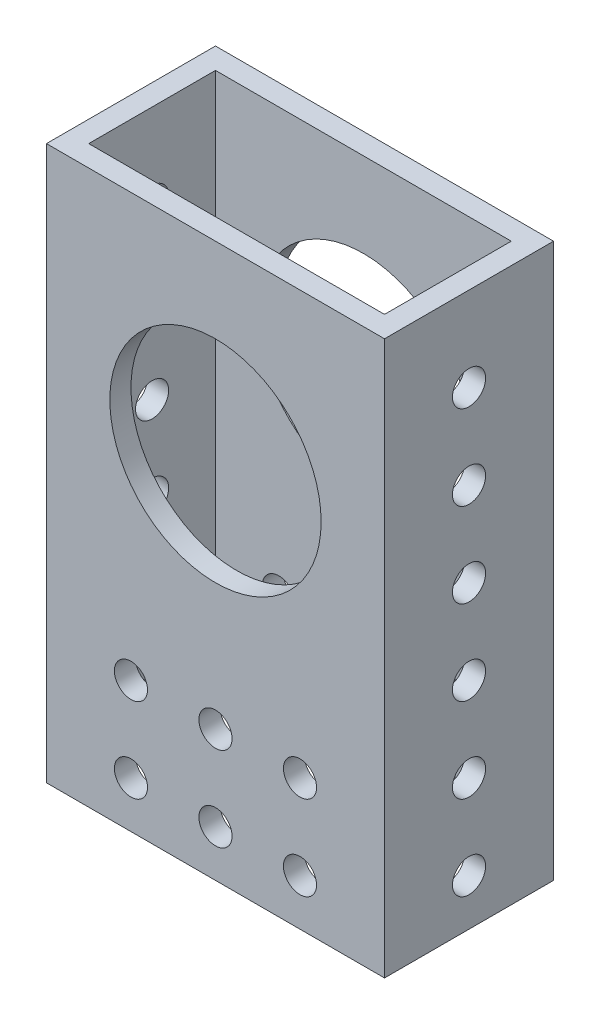
ISO-10303-21;
HEADER;
FILE_DESCRIPTION(('STEP AP214'),'2;1');
FILE_NAME('part.step','',(''),(''),'','','');
FILE_SCHEMA(('AUTOMOTIVE_DESIGN { 1 0 10303 214 1 1 1 1 }'));
ENDSEC;
DATA;
#1=APPLICATION_CONTEXT('core data for automotive mechanical design processes');
#2=APPLICATION_PROTOCOL_DEFINITION('international standard','automotive_design',2000,#1);
#3=PRODUCT_CONTEXT('',#1,'mechanical');
#4=PRODUCT('Part','Part','',(#3));
#5=PRODUCT_RELATED_PRODUCT_CATEGORY('part','',(#4));
#6=PRODUCT_DEFINITION_FORMATION('','',#4);
#7=PRODUCT_DEFINITION_CONTEXT('part definition',#1,'design');
#8=PRODUCT_DEFINITION('design','',#6,#7);
#9=PRODUCT_DEFINITION_SHAPE('','',#8);
#10=(LENGTH_UNIT() NAMED_UNIT(*) SI_UNIT(.MILLI.,.METRE.));
#11=(NAMED_UNIT(*) PLANE_ANGLE_UNIT() SI_UNIT($,.RADIAN.));
#12=(NAMED_UNIT(*) SI_UNIT($,.STERADIAN.) SOLID_ANGLE_UNIT());
#13=UNCERTAINTY_MEASURE_WITH_UNIT(LENGTH_MEASURE(1.E-05),#10,'distance_accuracy_value','');
#14=(GEOMETRIC_REPRESENTATION_CONTEXT(3) GLOBAL_UNCERTAINTY_ASSIGNED_CONTEXT((#13)) GLOBAL_UNIT_ASSIGNED_CONTEXT((#10,
#11,#12)) REPRESENTATION_CONTEXT('',''));
#15=CARTESIAN_POINT('',(0.,0.,0.));
#16=DIRECTION('',(0.,0.,1.));
#17=DIRECTION('',(1.,0.,0.));
#18=AXIS2_PLACEMENT_3D('',#15,#16,#17);
#19=CARTESIAN_POINT('',(25.4,196.85,25.4));
#20=DIRECTION('',(0.,0.,-1.));
#21=DIRECTION('',(-1.,0.,0.));
#22=AXIS2_PLACEMENT_3D('',#19,#20,#21);
#23=CYLINDRICAL_SURFACE('',#22,15.875);
#24=CARTESIAN_POINT('',(25.4,196.85,22.225));
#25=DIRECTION('',(0.,0.,1.));
#26=DIRECTION('',(1.,0.,0.));
#27=AXIS2_PLACEMENT_3D('',#24,#25,#26);
#28=CIRCLE('',#27,15.875);
#29=CARTESIAN_POINT('',(41.275,196.85,22.225));
#30=VERTEX_POINT('',#29);
#31=EDGE_CURVE('E140',#30,#30,#28,.T.);
#32=ORIENTED_EDGE('',*,*,#31,.F.);
#33=EDGE_LOOP('',(#32));
#34=FACE_BOUND('',#33,.T.);
#35=CARTESIAN_POINT('',(25.4,196.85,25.4));
#36=DIRECTION('',(0.,0.,1.));
#37=DIRECTION('',(1.,0.,0.));
#38=AXIS2_PLACEMENT_3D('',#35,#36,#37);
#39=CIRCLE('',#38,15.875);
#40=CARTESIAN_POINT('',(41.275,196.85,25.4));
#41=VERTEX_POINT('',#40);
#42=EDGE_CURVE('E120',#41,#41,#39,.T.);
#43=ORIENTED_EDGE('',*,*,#42,.T.);
#44=EDGE_LOOP('',(#43));
#45=FACE_BOUND('',#44,.T.);
#46=ADVANCED_FACE('F35',(#34,#45),#23,.F.);
#47=CARTESIAN_POINT('',(0.,212.725,12.7000000000007));
#48=DIRECTION('',(1.,0.,0.));
#49=DIRECTION('',(0.,0.,-1.));
#50=AXIS2_PLACEMENT_3D('',#47,#48,#49);
#51=CYLINDRICAL_SURFACE('',#50,2.48920000000001);
#52=CARTESIAN_POINT('',(47.625,212.725,12.7000000000007));
#53=DIRECTION('',(1.,0.,0.));
#54=DIRECTION('',(0.,1.,0.));
#55=AXIS2_PLACEMENT_3D('',#52,#53,#54);
#56=CIRCLE('',#55,2.48920000000001);
#57=CARTESIAN_POINT('',(47.625,215.2142,12.7000000000007));
#58=VERTEX_POINT('',#57);
#59=EDGE_CURVE('E314',#58,#58,#56,.F.);
#60=ORIENTED_EDGE('',*,*,#59,.T.);
#61=EDGE_LOOP('',(#60));
#62=FACE_BOUND('',#61,.T.);
#63=CARTESIAN_POINT('',(50.8,212.725,12.7000000000007));
#64=DIRECTION('',(1.,0.,0.));
#65=DIRECTION('',(0.,0.,-1.));
#66=AXIS2_PLACEMENT_3D('',#63,#64,#65);
#67=CIRCLE('',#66,2.48920000000001);
#68=CARTESIAN_POINT('',(50.8,212.725,10.2108000000007));
#69=VERTEX_POINT('',#68);
#70=EDGE_CURVE('E173',#69,#69,#67,.T.);
#71=ORIENTED_EDGE('',*,*,#70,.T.);
#72=EDGE_LOOP('',(#71));
#73=FACE_BOUND('',#72,.T.);
#74=ADVANCED_FACE('F374',(#62,#73),#51,.F.);
#75=CARTESIAN_POINT('',(0.,174.625,12.7000000000006));
#76=DIRECTION('',(1.,0.,0.));
#77=DIRECTION('',(0.,0.,-1.));
#78=AXIS2_PLACEMENT_3D('',#75,#76,#77);
#79=CYLINDRICAL_SURFACE('',#78,2.48920000000001);
#80=CARTESIAN_POINT('',(47.625,174.625,12.7000000000006));
#81=DIRECTION('',(1.,0.,0.));
#82=DIRECTION('',(0.,1.,0.));
#83=AXIS2_PLACEMENT_3D('',#80,#81,#82);
#84=CIRCLE('',#83,2.48920000000001);
#85=CARTESIAN_POINT('',(47.625,177.1142,12.7000000000006));
#86=VERTEX_POINT('',#85);
#87=EDGE_CURVE('E305',#86,#86,#84,.F.);
#88=ORIENTED_EDGE('',*,*,#87,.T.);
#89=EDGE_LOOP('',(#88));
#90=FACE_BOUND('',#89,.T.);
#91=CARTESIAN_POINT('',(50.8,174.625,12.7000000000006));
#92=DIRECTION('',(1.,0.,0.));
#93=DIRECTION('',(0.,0.,-1.));
#94=AXIS2_PLACEMENT_3D('',#91,#92,#93);
#95=CIRCLE('',#94,2.48920000000001);
#96=CARTESIAN_POINT('',(50.8,174.625,10.2108000000006));
#97=VERTEX_POINT('',#96);
#98=EDGE_CURVE('E190',#97,#97,#95,.T.);
#99=ORIENTED_EDGE('',*,*,#98,.T.);
#100=EDGE_LOOP('',(#99));
#101=FACE_BOUND('',#100,.T.);
#102=ADVANCED_FACE('F381',(#90,#101),#79,.F.);
#103=CARTESIAN_POINT('',(25.3999999999995,149.225,25.4));
#104=DIRECTION('',(0.,0.,-1.));
#105=DIRECTION('',(-1.,0.,0.));
#106=AXIS2_PLACEMENT_3D('',#103,#104,#105);
#107=CYLINDRICAL_SURFACE('',#106,2.48920000000001);
#108=CARTESIAN_POINT('',(25.3999999999995,149.225,22.225));
#109=DIRECTION('',(0.,0.,1.));
#110=DIRECTION('',(1.,0.,0.));
#111=AXIS2_PLACEMENT_3D('',#108,#109,#110);
#112=CIRCLE('',#111,2.48920000000001);
#113=CARTESIAN_POINT('',(27.8891999999996,149.225,22.225));
#114=VERTEX_POINT('',#113);
#115=EDGE_CURVE('E170',#114,#114,#112,.T.);
#116=ORIENTED_EDGE('',*,*,#115,.F.);
#117=EDGE_LOOP('',(#116));
#118=FACE_BOUND('',#117,.T.);
#119=CARTESIAN_POINT('',(25.3999999999995,149.225,25.4));
#120=DIRECTION('',(0.,0.,1.));
#121=DIRECTION('',(1.,0.,0.));
#122=AXIS2_PLACEMENT_3D('',#119,#120,#121);
#123=CIRCLE('',#122,2.48920000000001);
#124=CARTESIAN_POINT('',(27.8891999999996,149.225,25.4));
#125=VERTEX_POINT('',#124);
#126=EDGE_CURVE('E240',#125,#125,#123,.T.);
#127=ORIENTED_EDGE('',*,*,#126,.T.);
#128=EDGE_LOOP('',(#127));
#129=FACE_BOUND('',#128,.T.);
#130=ADVANCED_FACE('F394',(#118,#129),#107,.F.);
#131=CARTESIAN_POINT('',(38.0999999999995,149.225,25.4));
#132=DIRECTION('',(0.,0.,-1.));
#133=DIRECTION('',(-1.,0.,0.));
#134=AXIS2_PLACEMENT_3D('',#131,#132,#133);
#135=CYLINDRICAL_SURFACE('',#134,2.4892);
#136=CARTESIAN_POINT('',(38.0999999999995,149.225,22.225));
#137=DIRECTION('',(0.,0.,1.));
#138=DIRECTION('',(1.,0.,0.));
#139=AXIS2_PLACEMENT_3D('',#136,#137,#138);
#140=CIRCLE('',#139,2.4892);
#141=CARTESIAN_POINT('',(40.5891999999995,149.225,22.225));
#142=VERTEX_POINT('',#141);
#143=EDGE_CURVE('E167',#142,#142,#140,.T.);
#144=ORIENTED_EDGE('',*,*,#143,.F.);
#145=EDGE_LOOP('',(#144));
#146=FACE_BOUND('',#145,.T.);
#147=CARTESIAN_POINT('',(38.0999999999995,149.225,25.4));
#148=DIRECTION('',(0.,0.,1.));
#149=DIRECTION('',(1.,0.,0.));
#150=AXIS2_PLACEMENT_3D('',#147,#148,#149);
#151=CIRCLE('',#150,2.4892);
#152=CARTESIAN_POINT('',(40.5891999999995,149.225,25.4));
#153=VERTEX_POINT('',#152);
#154=EDGE_CURVE('E234',#153,#153,#151,.T.);
#155=ORIENTED_EDGE('',*,*,#154,.T.);
#156=EDGE_LOOP('',(#155));
#157=FACE_BOUND('',#156,.T.);
#158=ADVANCED_FACE('F341',(#146,#157),#135,.F.);
#159=CARTESIAN_POINT('',(12.6999999999995,149.225,25.4));
#160=DIRECTION('',(0.,0.,-1.));
#161=DIRECTION('',(-1.,0.,0.));
#162=AXIS2_PLACEMENT_3D('',#159,#160,#161);
#163=CYLINDRICAL_SURFACE('',#162,2.48920000000001);
#164=CARTESIAN_POINT('',(12.6999999999995,149.225,22.225));
#165=DIRECTION('',(0.,0.,1.));
#166=DIRECTION('',(1.,0.,0.));
#167=AXIS2_PLACEMENT_3D('',#164,#165,#166);
#168=CIRCLE('',#167,2.48920000000001);
#169=CARTESIAN_POINT('',(15.1891999999996,149.225,22.225));
#170=VERTEX_POINT('',#169);
#171=EDGE_CURVE('E164',#170,#170,#168,.T.);
#172=ORIENTED_EDGE('',*,*,#171,.F.);
#173=EDGE_LOOP('',(#172));
#174=FACE_BOUND('',#173,.T.);
#175=CARTESIAN_POINT('',(12.6999999999995,149.225,25.4));
#176=DIRECTION('',(0.,0.,1.));
#177=DIRECTION('',(1.,0.,0.));
#178=AXIS2_PLACEMENT_3D('',#175,#176,#177);
#179=CIRCLE('',#178,2.48920000000001);
#180=CARTESIAN_POINT('',(15.1891999999996,149.225,25.4));
#181=VERTEX_POINT('',#180);
#182=EDGE_CURVE('E228',#181,#181,#179,.T.);
#183=ORIENTED_EDGE('',*,*,#182,.T.);
#184=EDGE_LOOP('',(#183));
#185=FACE_BOUND('',#184,.T.);
#186=ADVANCED_FACE('F580',(#174,#185),#163,.F.);
#187=CARTESIAN_POINT('',(25.3999999999995,161.925,25.4));
#188=DIRECTION('',(0.,0.,-1.));
#189=DIRECTION('',(-1.,0.,0.));
#190=AXIS2_PLACEMENT_3D('',#187,#188,#189);
#191=CYLINDRICAL_SURFACE('',#190,2.48920000000001);
#192=CARTESIAN_POINT('',(25.3999999999995,161.925,22.225));
#193=DIRECTION('',(0.,0.,1.));
#194=DIRECTION('',(1.,0.,0.));
#195=AXIS2_PLACEMENT_3D('',#192,#193,#194);
#196=CIRCLE('',#195,2.48920000000001);
#197=CARTESIAN_POINT('',(27.8891999999995,161.925,22.225));
#198=VERTEX_POINT('',#197);
#199=EDGE_CURVE('E161',#198,#198,#196,.T.);
#200=ORIENTED_EDGE('',*,*,#199,.F.);
#201=EDGE_LOOP('',(#200));
#202=FACE_BOUND('',#201,.T.);
#203=CARTESIAN_POINT('',(25.3999999999995,161.925,25.4));
#204=DIRECTION('',(0.,0.,1.));
#205=DIRECTION('',(1.,0.,0.));
#206=AXIS2_PLACEMENT_3D('',#203,#204,#205);
#207=CIRCLE('',#206,2.48920000000001);
#208=CARTESIAN_POINT('',(27.8891999999995,161.925,25.4));
#209=VERTEX_POINT('',#208);
#210=EDGE_CURVE('E222',#209,#209,#207,.T.);
#211=ORIENTED_EDGE('',*,*,#210,.T.);
#212=EDGE_LOOP('',(#211));
#213=FACE_BOUND('',#212,.T.);
#214=ADVANCED_FACE('F587',(#202,#213),#191,.F.);
#215=CARTESIAN_POINT('',(38.0999999999995,161.925,25.4));
#216=DIRECTION('',(0.,0.,-1.));
#217=DIRECTION('',(-1.,0.,0.));
#218=AXIS2_PLACEMENT_3D('',#215,#216,#217);
#219=CYLINDRICAL_SURFACE('',#218,2.4892);
#220=CARTESIAN_POINT('',(38.0999999999995,161.925,22.225));
#221=DIRECTION('',(0.,0.,1.));
#222=DIRECTION('',(1.,0.,0.));
#223=AXIS2_PLACEMENT_3D('',#220,#221,#222);
#224=CIRCLE('',#223,2.4892);
#225=CARTESIAN_POINT('',(40.5891999999995,161.925,22.225));
#226=VERTEX_POINT('',#225);
#227=EDGE_CURVE('E147',#226,#226,#224,.T.);
#228=ORIENTED_EDGE('',*,*,#227,.F.);
#229=EDGE_LOOP('',(#228));
#230=FACE_BOUND('',#229,.T.);
#231=CARTESIAN_POINT('',(38.0999999999995,161.925,25.4));
#232=DIRECTION('',(0.,0.,1.));
#233=DIRECTION('',(1.,0.,0.));
#234=AXIS2_PLACEMENT_3D('',#231,#232,#233);
#235=CIRCLE('',#234,2.4892);
#236=CARTESIAN_POINT('',(40.5891999999995,161.925,25.4));
#237=VERTEX_POINT('',#236);
#238=EDGE_CURVE('E216',#237,#237,#235,.T.);
#239=ORIENTED_EDGE('',*,*,#238,.T.);
#240=EDGE_LOOP('',(#239));
#241=FACE_BOUND('',#240,.T.);
#242=ADVANCED_FACE('F368',(#230,#241),#219,.F.);
#243=CARTESIAN_POINT('',(12.6999999999995,161.925,25.4));
#244=DIRECTION('',(0.,0.,-1.));
#245=DIRECTION('',(-1.,0.,0.));
#246=AXIS2_PLACEMENT_3D('',#243,#244,#245);
#247=CYLINDRICAL_SURFACE('',#246,2.4892);
#248=CARTESIAN_POINT('',(12.6999999999995,161.925,22.225));
#249=DIRECTION('',(0.,0.,1.));
#250=DIRECTION('',(1.,0.,0.));
#251=AXIS2_PLACEMENT_3D('',#248,#249,#250);
#252=CIRCLE('',#251,2.4892);
#253=CARTESIAN_POINT('',(15.1891999999995,161.925,22.225));
#254=VERTEX_POINT('',#253);
#255=EDGE_CURVE('E142',#254,#254,#252,.T.);
#256=ORIENTED_EDGE('',*,*,#255,.F.);
#257=EDGE_LOOP('',(#256));
#258=FACE_BOUND('',#257,.T.);
#259=CARTESIAN_POINT('',(12.6999999999995,161.925,25.4));
#260=DIRECTION('',(0.,0.,1.));
#261=DIRECTION('',(1.,0.,0.));
#262=AXIS2_PLACEMENT_3D('',#259,#260,#261);
#263=CIRCLE('',#262,2.4892);
#264=CARTESIAN_POINT('',(15.1891999999995,161.925,25.4));
#265=VERTEX_POINT('',#264);
#266=EDGE_CURVE('E210',#265,#265,#263,.T.);
#267=ORIENTED_EDGE('',*,*,#266,.T.);
#268=EDGE_LOOP('',(#267));
#269=FACE_BOUND('',#268,.T.);
#270=ADVANCED_FACE('F357',(#258,#269),#247,.F.);
#271=CARTESIAN_POINT('',(0.,0.,25.4));
#272=DIRECTION('',(0.,0.,-1.));
#273=DIRECTION('',(-1.,0.,0.));
#274=AXIS2_PLACEMENT_3D('',#271,#272,#273);
#275=PLANE('',#274);
#276=DIRECTION('',(0.,-1.,0.));
#277=VECTOR('',#276,1.);
#278=CARTESIAN_POINT('',(0.,0.,25.4));
#279=LINE('',#278,#277);
#280=CARTESIAN_POINT('',(0.,225.425,25.4));
#281=VERTEX_POINT('',#280);
#282=CARTESIAN_POINT('',(0.,142.24,25.4));
#283=VERTEX_POINT('',#282);
#284=EDGE_CURVE('E132',#281,#283,#279,.T.);
#285=ORIENTED_EDGE('',*,*,#284,.T.);
#286=DIRECTION('',(-1.,0.,0.));
#287=VECTOR('',#286,1.);
#288=CARTESIAN_POINT('',(0.,142.24,25.4));
#289=LINE('',#288,#287);
#290=CARTESIAN_POINT('',(50.8,142.24,25.4));
#291=VERTEX_POINT('',#290);
#292=EDGE_CURVE('E100',#291,#283,#289,.T.);
#293=ORIENTED_EDGE('',*,*,#292,.F.);
#294=DIRECTION('',(0.,1.,0.));
#295=VECTOR('',#294,1.);
#296=CARTESIAN_POINT('',(50.8,0.,25.4));
#297=LINE('',#296,#295);
#298=CARTESIAN_POINT('',(50.8,225.425,25.4));
#299=VERTEX_POINT('',#298);
#300=EDGE_CURVE('E247',#291,#299,#297,.T.);
#301=ORIENTED_EDGE('',*,*,#300,.T.);
#302=DIRECTION('',(-1.,0.,0.));
#303=VECTOR('',#302,1.);
#304=CARTESIAN_POINT('',(0.,225.425,25.4));
#305=LINE('',#304,#303);
#306=EDGE_CURVE('E128',#299,#281,#305,.T.);
#307=ORIENTED_EDGE('',*,*,#306,.T.);
#308=EDGE_LOOP('',(#285,#293,#301,#307));
#309=FACE_BOUND('',#308,.T.);
#310=ORIENTED_EDGE('',*,*,#42,.F.);
#311=EDGE_LOOP('',(#310));
#312=FACE_BOUND('',#311,.T.);
#313=ORIENTED_EDGE('',*,*,#126,.F.);
#314=EDGE_LOOP('',(#313));
#315=FACE_BOUND('',#314,.T.);
#316=ORIENTED_EDGE('',*,*,#154,.F.);
#317=EDGE_LOOP('',(#316));
#318=FACE_BOUND('',#317,.T.);
#319=ORIENTED_EDGE('',*,*,#182,.F.);
#320=EDGE_LOOP('',(#319));
#321=FACE_BOUND('',#320,.T.);
#322=ORIENTED_EDGE('',*,*,#210,.F.);
#323=EDGE_LOOP('',(#322));
#324=FACE_BOUND('',#323,.T.);
#325=ORIENTED_EDGE('',*,*,#238,.F.);
#326=EDGE_LOOP('',(#325));
#327=FACE_BOUND('',#326,.T.);
#328=ORIENTED_EDGE('',*,*,#266,.F.);
#329=EDGE_LOOP('',(#328));
#330=FACE_BOUND('',#329,.T.);
#331=ADVANCED_FACE('F252',(#309,#312,#315,#318,#321,#324,#327,#330),#275,.F.);
#332=CARTESIAN_POINT('',(0.,0.,0.));
#333=DIRECTION('',(0.,0.,-1.));
#334=DIRECTION('',(-1.,0.,0.));
#335=AXIS2_PLACEMENT_3D('',#332,#333,#334);
#336=PLANE('',#335);
#337=DIRECTION('',(-1.,0.,0.));
#338=VECTOR('',#337,1.);
#339=CARTESIAN_POINT('',(0.,142.24,0.));
#340=LINE('',#339,#338);
#341=CARTESIAN_POINT('',(50.8,142.24,0.));
#342=VERTEX_POINT('',#341);
#343=CARTESIAN_POINT('',(0.,142.24,0.));
#344=VERTEX_POINT('',#343);
#345=EDGE_CURVE('E50',#342,#344,#340,.T.);
#346=ORIENTED_EDGE('',*,*,#345,.T.);
#347=DIRECTION('',(0.,-1.,0.));
#348=VECTOR('',#347,1.);
#349=CARTESIAN_POINT('',(0.,0.,0.));
#350=LINE('',#349,#348);
#351=CARTESIAN_POINT('',(0.,225.425,0.));
#352=VERTEX_POINT('',#351);
#353=EDGE_CURVE('E114',#352,#344,#350,.T.);
#354=ORIENTED_EDGE('',*,*,#353,.F.);
#355=DIRECTION('',(-1.,0.,0.));
#356=VECTOR('',#355,1.);
#357=CARTESIAN_POINT('',(0.,225.425,0.));
#358=LINE('',#357,#356);
#359=CARTESIAN_POINT('',(50.8,225.425,0.));
#360=VERTEX_POINT('',#359);
#361=EDGE_CURVE('E122',#360,#352,#358,.T.);
#362=ORIENTED_EDGE('',*,*,#361,.F.);
#363=DIRECTION('',(0.,1.,0.));
#364=VECTOR('',#363,1.);
#365=CARTESIAN_POINT('',(50.8,0.,0.));
#366=LINE('',#365,#364);
#367=EDGE_CURVE('E115',#342,#360,#366,.T.);
#368=ORIENTED_EDGE('',*,*,#367,.F.);
#369=EDGE_LOOP('',(#346,#354,#362,#368));
#370=FACE_BOUND('',#369,.T.);
#371=CARTESIAN_POINT('',(38.0999999999995,161.925,0.));
#372=DIRECTION('',(0.,0.,1.));
#373=DIRECTION('',(1.,0.,0.));
#374=AXIS2_PLACEMENT_3D('',#371,#372,#373);
#375=CIRCLE('',#374,2.4892);
#376=CARTESIAN_POINT('',(40.5891999999995,161.925,0.));
#377=VERTEX_POINT('',#376);
#378=EDGE_CURVE('E213',#377,#377,#375,.T.);
#379=ORIENTED_EDGE('',*,*,#378,.T.);
#380=EDGE_LOOP('',(#379));
#381=FACE_BOUND('',#380,.T.);
#382=CARTESIAN_POINT('',(12.6999999999995,149.225,0.));
#383=DIRECTION('',(0.,0.,1.));
#384=DIRECTION('',(1.,0.,0.));
#385=AXIS2_PLACEMENT_3D('',#382,#383,#384);
#386=CIRCLE('',#385,2.48920000000001);
#387=CARTESIAN_POINT('',(15.1891999999996,149.225,0.));
#388=VERTEX_POINT('',#387);
#389=EDGE_CURVE('E225',#388,#388,#386,.T.);
#390=ORIENTED_EDGE('',*,*,#389,.T.);
#391=EDGE_LOOP('',(#390));
#392=FACE_BOUND('',#391,.T.);
#393=CARTESIAN_POINT('',(25.3999999999995,149.225,0.));
#394=DIRECTION('',(0.,0.,1.));
#395=DIRECTION('',(1.,0.,0.));
#396=AXIS2_PLACEMENT_3D('',#393,#394,#395);
#397=CIRCLE('',#396,2.48920000000001);
#398=CARTESIAN_POINT('',(27.8891999999996,149.225,0.));
#399=VERTEX_POINT('',#398);
#400=EDGE_CURVE('E237',#399,#399,#397,.T.);
#401=ORIENTED_EDGE('',*,*,#400,.T.);
#402=EDGE_LOOP('',(#401));
#403=FACE_BOUND('',#402,.T.);
#404=CARTESIAN_POINT('',(25.4,196.85,0.));
#405=DIRECTION('',(0.,0.,1.));
#406=DIRECTION('',(1.,0.,0.));
#407=AXIS2_PLACEMENT_3D('',#404,#405,#406);
#408=CIRCLE('',#407,15.875);
#409=CARTESIAN_POINT('',(41.275,196.85,0.));
#410=VERTEX_POINT('',#409);
#411=EDGE_CURVE('E125',#410,#410,#408,.T.);
#412=ORIENTED_EDGE('',*,*,#411,.T.);
#413=EDGE_LOOP('',(#412));
#414=FACE_BOUND('',#413,.T.);
#415=CARTESIAN_POINT('',(38.0999999999995,149.225,0.));
#416=DIRECTION('',(0.,0.,1.));
#417=DIRECTION('',(1.,0.,0.));
#418=AXIS2_PLACEMENT_3D('',#415,#416,#417);
#419=CIRCLE('',#418,2.4892);
#420=CARTESIAN_POINT('',(40.5891999999995,149.225,0.));
#421=VERTEX_POINT('',#420);
#422=EDGE_CURVE('E231',#421,#421,#419,.T.);
#423=ORIENTED_EDGE('',*,*,#422,.T.);
#424=EDGE_LOOP('',(#423));
#425=FACE_BOUND('',#424,.T.);
#426=CARTESIAN_POINT('',(25.3999999999995,161.925,0.));
#427=DIRECTION('',(0.,0.,1.));
#428=DIRECTION('',(1.,0.,0.));
#429=AXIS2_PLACEMENT_3D('',#426,#427,#428);
#430=CIRCLE('',#429,2.48920000000001);
#431=CARTESIAN_POINT('',(27.8891999999995,161.925,0.));
#432=VERTEX_POINT('',#431);
#433=EDGE_CURVE('E219',#432,#432,#430,.T.);
#434=ORIENTED_EDGE('',*,*,#433,.T.);
#435=EDGE_LOOP('',(#434));
#436=FACE_BOUND('',#435,.T.);
#437=CARTESIAN_POINT('',(12.6999999999995,161.925,0.));
#438=DIRECTION('',(0.,0.,1.));
#439=DIRECTION('',(1.,0.,0.));
#440=AXIS2_PLACEMENT_3D('',#437,#438,#439);
#441=CIRCLE('',#440,2.4892);
#442=CARTESIAN_POINT('',(15.1891999999995,161.925,0.));
#443=VERTEX_POINT('',#442);
#444=EDGE_CURVE('E177',#443,#443,#441,.T.);
#445=ORIENTED_EDGE('',*,*,#444,.T.);
#446=EDGE_LOOP('',(#445));
#447=FACE_BOUND('',#446,.T.);
#448=ADVANCED_FACE('F111',(#370,#381,#392,#403,#414,#425,#436,#447),#336,.T.);
#449=CARTESIAN_POINT('',(0.,0.,25.4));
#450=DIRECTION('',(1.,0.,0.));
#451=DIRECTION('',(0.,0.,-1.));
#452=AXIS2_PLACEMENT_3D('',#449,#450,#451);
#453=PLANE('',#452);
#454=CARTESIAN_POINT('',(0.,149.225,12.7000000000005));
#455=DIRECTION('',(1.,0.,0.));
#456=DIRECTION('',(0.,0.,-1.));
#457=AXIS2_PLACEMENT_3D('',#454,#455,#456);
#458=CIRCLE('',#457,2.48920000000001);
#459=CARTESIAN_POINT('',(0.,149.225,10.2108000000005));
#460=VERTEX_POINT('',#459);
#461=EDGE_CURVE('E174',#460,#460,#458,.T.);
#462=ORIENTED_EDGE('',*,*,#461,.T.);
#463=EDGE_LOOP('',(#462));
#464=FACE_BOUND('',#463,.T.);
#465=CARTESIAN_POINT('',(0.,161.925,12.7000000000005));
#466=DIRECTION('',(1.,0.,0.));
#467=DIRECTION('',(0.,0.,-1.));
#468=AXIS2_PLACEMENT_3D('',#465,#466,#467);
#469=CIRCLE('',#468,2.4892);
#470=CARTESIAN_POINT('',(0.,161.925,10.2108000000005));
#471=VERTEX_POINT('',#470);
#472=EDGE_CURVE('E181',#471,#471,#469,.T.);
#473=ORIENTED_EDGE('',*,*,#472,.T.);
#474=EDGE_LOOP('',(#473));
#475=FACE_BOUND('',#474,.T.);
#476=CARTESIAN_POINT('',(0.,174.625,12.7000000000006));
#477=DIRECTION('',(1.,0.,0.));
#478=DIRECTION('',(0.,0.,-1.));
#479=AXIS2_PLACEMENT_3D('',#476,#477,#478);
#480=CIRCLE('',#479,2.48920000000001);
#481=CARTESIAN_POINT('',(0.,174.625,10.2108000000006));
#482=VERTEX_POINT('',#481);
#483=EDGE_CURVE('E187',#482,#482,#480,.T.);
#484=ORIENTED_EDGE('',*,*,#483,.T.);
#485=EDGE_LOOP('',(#484));
#486=FACE_BOUND('',#485,.T.);
#487=CARTESIAN_POINT('',(0.,187.325,12.7000000000006));
#488=DIRECTION('',(1.,0.,0.));
#489=DIRECTION('',(0.,0.,-1.));
#490=AXIS2_PLACEMENT_3D('',#487,#488,#489);
#491=CIRCLE('',#490,2.48920000000001);
#492=CARTESIAN_POINT('',(0.,187.325,10.2108000000006));
#493=VERTEX_POINT('',#492);
#494=EDGE_CURVE('E193',#493,#493,#491,.T.);
#495=ORIENTED_EDGE('',*,*,#494,.T.);
#496=EDGE_LOOP('',(#495));
#497=FACE_BOUND('',#496,.T.);
#498=CARTESIAN_POINT('',(0.,200.025,12.7000000000007));
#499=DIRECTION('',(1.,0.,0.));
#500=DIRECTION('',(0.,0.,-1.));
#501=AXIS2_PLACEMENT_3D('',#498,#499,#500);
#502=CIRCLE('',#501,2.4892);
#503=CARTESIAN_POINT('',(0.,200.025,10.2108000000006));
#504=VERTEX_POINT('',#503);
#505=EDGE_CURVE('E199',#504,#504,#502,.T.);
#506=ORIENTED_EDGE('',*,*,#505,.T.);
#507=EDGE_LOOP('',(#506));
#508=FACE_BOUND('',#507,.T.);
#509=CARTESIAN_POINT('',(0.,212.725,12.7000000000007));
#510=DIRECTION('',(1.,0.,0.));
#511=DIRECTION('',(0.,0.,-1.));
#512=AXIS2_PLACEMENT_3D('',#509,#510,#511);
#513=CIRCLE('',#512,2.48920000000001);
#514=CARTESIAN_POINT('',(0.,212.725,10.2108000000007));
#515=VERTEX_POINT('',#514);
#516=EDGE_CURVE('E205',#515,#515,#513,.T.);
#517=ORIENTED_EDGE('',*,*,#516,.T.);
#518=EDGE_LOOP('',(#517));
#519=FACE_BOUND('',#518,.T.);
#520=ORIENTED_EDGE('',*,*,#353,.T.);
#521=DIRECTION('',(0.,0.,1.));
#522=VECTOR('',#521,1.);
#523=CARTESIAN_POINT('',(0.,142.24,0.));
#524=LINE('',#523,#522);
#525=EDGE_CURVE('E97',#344,#283,#524,.T.);
#526=ORIENTED_EDGE('',*,*,#525,.T.);
#527=ORIENTED_EDGE('',*,*,#284,.F.);
#528=DIRECTION('',(0.,0.,-1.));
#529=VECTOR('',#528,1.);
#530=CARTESIAN_POINT('',(0.,225.425,25.4));
#531=LINE('',#530,#529);
#532=EDGE_CURVE('E119',#281,#352,#531,.T.);
#533=ORIENTED_EDGE('',*,*,#532,.T.);
#534=EDGE_LOOP('',(#520,#526,#527,#533));
#535=FACE_BOUND('',#534,.T.);
#536=ADVANCED_FACE('F37',(#464,#475,#486,#497,#508,#519,#535),#453,.F.);
#537=CARTESIAN_POINT('',(50.8,0.,25.4));
#538=DIRECTION('',(-1.,0.,0.));
#539=DIRECTION('',(0.,0.,1.));
#540=AXIS2_PLACEMENT_3D('',#537,#538,#539);
#541=PLANE('',#540);
#542=CARTESIAN_POINT('',(50.8,149.225,12.7000000000005));
#543=DIRECTION('',(1.,0.,0.));
#544=DIRECTION('',(0.,0.,-1.));
#545=AXIS2_PLACEMENT_3D('',#542,#543,#544);
#546=CIRCLE('',#545,2.48920000000001);
#547=CARTESIAN_POINT('',(50.8,149.225,10.2108000000005));
#548=VERTEX_POINT('',#547);
#549=EDGE_CURVE('E178',#548,#548,#546,.T.);
#550=ORIENTED_EDGE('',*,*,#549,.F.);
#551=EDGE_LOOP('',(#550));
#552=FACE_BOUND('',#551,.T.);
#553=CARTESIAN_POINT('',(50.8,161.925,12.7000000000005));
#554=DIRECTION('',(1.,0.,0.));
#555=DIRECTION('',(0.,0.,-1.));
#556=AXIS2_PLACEMENT_3D('',#553,#554,#555);
#557=CIRCLE('',#556,2.4892);
#558=CARTESIAN_POINT('',(50.8,161.925,10.2108000000005));
#559=VERTEX_POINT('',#558);
#560=EDGE_CURVE('E184',#559,#559,#557,.T.);
#561=ORIENTED_EDGE('',*,*,#560,.F.);
#562=EDGE_LOOP('',(#561));
#563=FACE_BOUND('',#562,.T.);
#564=ORIENTED_EDGE('',*,*,#98,.F.);
#565=EDGE_LOOP('',(#564));
#566=FACE_BOUND('',#565,.T.);
#567=CARTESIAN_POINT('',(50.8,187.325,12.7000000000006));
#568=DIRECTION('',(1.,0.,0.));
#569=DIRECTION('',(0.,0.,-1.));
#570=AXIS2_PLACEMENT_3D('',#567,#568,#569);
#571=CIRCLE('',#570,2.48920000000001);
#572=CARTESIAN_POINT('',(50.8,187.325,10.2108000000006));
#573=VERTEX_POINT('',#572);
#574=EDGE_CURVE('E196',#573,#573,#571,.T.);
#575=ORIENTED_EDGE('',*,*,#574,.F.);
#576=EDGE_LOOP('',(#575));
#577=FACE_BOUND('',#576,.T.);
#578=CARTESIAN_POINT('',(50.8,200.025,12.7000000000007));
#579=DIRECTION('',(1.,0.,0.));
#580=DIRECTION('',(0.,0.,-1.));
#581=AXIS2_PLACEMENT_3D('',#578,#579,#580);
#582=CIRCLE('',#581,2.4892);
#583=CARTESIAN_POINT('',(50.8,200.025,10.2108000000006));
#584=VERTEX_POINT('',#583);
#585=EDGE_CURVE('E202',#584,#584,#582,.T.);
#586=ORIENTED_EDGE('',*,*,#585,.F.);
#587=EDGE_LOOP('',(#586));
#588=FACE_BOUND('',#587,.T.);
#589=ORIENTED_EDGE('',*,*,#70,.F.);
#590=EDGE_LOOP('',(#589));
#591=FACE_BOUND('',#590,.T.);
#592=ORIENTED_EDGE('',*,*,#300,.F.);
#593=DIRECTION('',(0.,0.,1.));
#594=VECTOR('',#593,1.);
#595=CARTESIAN_POINT('',(50.8,142.24,0.));
#596=LINE('',#595,#594);
#597=EDGE_CURVE('E106',#342,#291,#596,.T.);
#598=ORIENTED_EDGE('',*,*,#597,.F.);
#599=ORIENTED_EDGE('',*,*,#367,.T.);
#600=DIRECTION('',(0.,0.,-1.));
#601=VECTOR('',#600,1.);
#602=CARTESIAN_POINT('',(50.8,225.425,25.4));
#603=LINE('',#602,#601);
#604=EDGE_CURVE('E43',#299,#360,#603,.T.);
#605=ORIENTED_EDGE('',*,*,#604,.F.);
#606=EDGE_LOOP('',(#592,#598,#599,#605));
#607=FACE_BOUND('',#606,.T.);
#608=ADVANCED_FACE('F257',(#552,#563,#566,#577,#588,#591,#607),#541,.F.);
#609=CARTESIAN_POINT('',(0.,225.425,25.4));
#610=DIRECTION('',(0.,-1.,0.));
#611=DIRECTION('',(1.,0.,0.));
#612=AXIS2_PLACEMENT_3D('',#609,#610,#611);
#613=PLANE('',#612);
#614=DIRECTION('',(-1.,0.,0.));
#615=VECTOR('',#614,1.);
#616=CARTESIAN_POINT('',(47.625,225.425,3.175));
#617=LINE('',#616,#615);
#618=CARTESIAN_POINT('',(47.6250000000001,225.425,3.175));
#619=VERTEX_POINT('',#618);
#620=CARTESIAN_POINT('',(3.175,225.425,3.175));
#621=VERTEX_POINT('',#620);
#622=EDGE_CURVE('E270',#619,#621,#617,.T.);
#623=ORIENTED_EDGE('',*,*,#622,.F.);
#624=DIRECTION('',(0.,0.,-1.));
#625=VECTOR('',#624,1.);
#626=CARTESIAN_POINT('',(47.625,225.425,22.225));
#627=LINE('',#626,#625);
#628=CARTESIAN_POINT('',(47.625,225.425,22.225));
#629=VERTEX_POINT('',#628);
#630=EDGE_CURVE('E267',#629,#619,#627,.T.);
#631=ORIENTED_EDGE('',*,*,#630,.F.);
#632=DIRECTION('',(1.,0.,0.));
#633=VECTOR('',#632,1.);
#634=CARTESIAN_POINT('',(3.175,225.425,22.225));
#635=LINE('',#634,#633);
#636=CARTESIAN_POINT('',(3.175,225.425,22.225));
#637=VERTEX_POINT('',#636);
#638=EDGE_CURVE('E276',#637,#629,#635,.T.);
#639=ORIENTED_EDGE('',*,*,#638,.F.);
#640=DIRECTION('',(0.,0.,1.));
#641=VECTOR('',#640,1.);
#642=CARTESIAN_POINT('',(3.175,225.425,3.175));
#643=LINE('',#642,#641);
#644=EDGE_CURVE('E273',#621,#637,#643,.T.);
#645=ORIENTED_EDGE('',*,*,#644,.F.);
#646=EDGE_LOOP('',(#623,#631,#639,#645));
#647=FACE_BOUND('',#646,.T.);
#648=ORIENTED_EDGE('',*,*,#361,.T.);
#649=ORIENTED_EDGE('',*,*,#532,.F.);
#650=ORIENTED_EDGE('',*,*,#306,.F.);
#651=ORIENTED_EDGE('',*,*,#604,.T.);
#652=EDGE_LOOP('',(#648,#649,#650,#651));
#653=FACE_BOUND('',#652,.T.);
#654=ADVANCED_FACE('F255',(#647,#653),#613,.F.);
#655=CARTESIAN_POINT('',(25.4,196.85,3.175));
#656=DIRECTION('',(0.,0.,-1.));
#657=DIRECTION('',(-1.,0.,0.));
#658=AXIS2_PLACEMENT_3D('',#655,#656,#657);
#659=CIRCLE('',#658,15.875);
#660=CARTESIAN_POINT('',(9.52499999999998,196.85,3.175));
#661=VERTEX_POINT('',#660);
#662=EDGE_CURVE('E143',#661,#661,#659,.T.);
#663=ORIENTED_EDGE('',*,*,#662,.F.);
#664=EDGE_LOOP('',(#663));
#665=FACE_BOUND('',#664,.T.);
#666=ORIENTED_EDGE('',*,*,#411,.F.);
#667=EDGE_LOOP('',(#666));
#668=FACE_BOUND('',#667,.T.);
#669=ADVANCED_FACE('F377',(#665,#668),#23,.F.);
#670=CARTESIAN_POINT('',(25.3999999999995,149.225,3.175));
#671=DIRECTION('',(0.,0.,-1.));
#672=DIRECTION('',(-1.,0.,0.));
#673=AXIS2_PLACEMENT_3D('',#670,#671,#672);
#674=CIRCLE('',#673,2.48920000000001);
#675=CARTESIAN_POINT('',(22.9107999999995,149.225,3.175));
#676=VERTEX_POINT('',#675);
#677=EDGE_CURVE('E150',#676,#676,#674,.T.);
#678=ORIENTED_EDGE('',*,*,#677,.F.);
#679=EDGE_LOOP('',(#678));
#680=FACE_BOUND('',#679,.T.);
#681=ORIENTED_EDGE('',*,*,#400,.F.);
#682=EDGE_LOOP('',(#681));
#683=FACE_BOUND('',#682,.T.);
#684=ADVANCED_FACE('F339',(#680,#683),#107,.F.);
#685=CARTESIAN_POINT('',(38.0999999999995,149.225,3.175));
#686=DIRECTION('',(0.,0.,-1.));
#687=DIRECTION('',(-1.,0.,0.));
#688=AXIS2_PLACEMENT_3D('',#685,#686,#687);
#689=CIRCLE('',#688,2.4892);
#690=CARTESIAN_POINT('',(35.6107999999995,149.225,3.175));
#691=VERTEX_POINT('',#690);
#692=EDGE_CURVE('E155',#691,#691,#689,.T.);
#693=ORIENTED_EDGE('',*,*,#692,.F.);
#694=EDGE_LOOP('',(#693));
#695=FACE_BOUND('',#694,.T.);
#696=ORIENTED_EDGE('',*,*,#422,.F.);
#697=EDGE_LOOP('',(#696));
#698=FACE_BOUND('',#697,.T.);
#699=ADVANCED_FACE('F335',(#695,#698),#135,.F.);
#700=CARTESIAN_POINT('',(12.6999999999995,149.225,3.175));
#701=DIRECTION('',(0.,0.,-1.));
#702=DIRECTION('',(-1.,0.,0.));
#703=AXIS2_PLACEMENT_3D('',#700,#701,#702);
#704=CIRCLE('',#703,2.48920000000001);
#705=CARTESIAN_POINT('',(10.2107999999995,149.225,3.175));
#706=VERTEX_POINT('',#705);
#707=EDGE_CURVE('E327',#706,#706,#704,.T.);
#708=ORIENTED_EDGE('',*,*,#707,.F.);
#709=EDGE_LOOP('',(#708));
#710=FACE_BOUND('',#709,.T.);
#711=ORIENTED_EDGE('',*,*,#389,.F.);
#712=EDGE_LOOP('',(#711));
#713=FACE_BOUND('',#712,.T.);
#714=ADVANCED_FACE('F338',(#710,#713),#163,.F.);
#715=CARTESIAN_POINT('',(25.3999999999995,161.925,3.175));
#716=DIRECTION('',(0.,0.,-1.));
#717=DIRECTION('',(-1.,0.,0.));
#718=AXIS2_PLACEMENT_3D('',#715,#716,#717);
#719=CIRCLE('',#718,2.48920000000001);
#720=CARTESIAN_POINT('',(22.9107999999995,161.925,3.175));
#721=VERTEX_POINT('',#720);
#722=EDGE_CURVE('E324',#721,#721,#719,.T.);
#723=ORIENTED_EDGE('',*,*,#722,.F.);
#724=EDGE_LOOP('',(#723));
#725=FACE_BOUND('',#724,.T.);
#726=ORIENTED_EDGE('',*,*,#433,.F.);
#727=EDGE_LOOP('',(#726));
#728=FACE_BOUND('',#727,.T.);
#729=ADVANCED_FACE('F365',(#725,#728),#191,.F.);
#730=CARTESIAN_POINT('',(38.0999999999995,161.925,3.175));
#731=DIRECTION('',(0.,0.,-1.));
#732=DIRECTION('',(-1.,0.,0.));
#733=AXIS2_PLACEMENT_3D('',#730,#731,#732);
#734=CIRCLE('',#733,2.4892);
#735=CARTESIAN_POINT('',(35.6107999999995,161.925,3.175));
#736=VERTEX_POINT('',#735);
#737=EDGE_CURVE('E138',#736,#736,#734,.T.);
#738=ORIENTED_EDGE('',*,*,#737,.F.);
#739=EDGE_LOOP('',(#738));
#740=FACE_BOUND('',#739,.T.);
#741=ORIENTED_EDGE('',*,*,#378,.F.);
#742=EDGE_LOOP('',(#741));
#743=FACE_BOUND('',#742,.T.);
#744=ADVANCED_FACE('F354',(#740,#743),#219,.F.);
#745=CARTESIAN_POINT('',(12.6999999999995,161.925,3.175));
#746=DIRECTION('',(0.,0.,-1.));
#747=DIRECTION('',(-1.,0.,0.));
#748=AXIS2_PLACEMENT_3D('',#745,#746,#747);
#749=CIRCLE('',#748,2.4892);
#750=CARTESIAN_POINT('',(10.2107999999995,161.925,3.175));
#751=VERTEX_POINT('',#750);
#752=EDGE_CURVE('E136',#751,#751,#749,.T.);
#753=ORIENTED_EDGE('',*,*,#752,.F.);
#754=EDGE_LOOP('',(#753));
#755=FACE_BOUND('',#754,.T.);
#756=ORIENTED_EDGE('',*,*,#444,.F.);
#757=EDGE_LOOP('',(#756));
#758=FACE_BOUND('',#757,.T.);
#759=ADVANCED_FACE('F351',(#755,#758),#247,.F.);
#760=CARTESIAN_POINT('',(0.,161.925,12.7000000000005));
#761=DIRECTION('',(1.,0.,0.));
#762=DIRECTION('',(0.,0.,-1.));
#763=AXIS2_PLACEMENT_3D('',#760,#761,#762);
#764=CYLINDRICAL_SURFACE('',#763,2.4892);
#765=CARTESIAN_POINT('',(3.17500000000003,161.925,12.7000000000005));
#766=DIRECTION('',(-1.,0.,0.));
#767=DIRECTION('',(0.,-1.,0.));
#768=AXIS2_PLACEMENT_3D('',#765,#766,#767);
#769=CIRCLE('',#768,2.4892);
#770=CARTESIAN_POINT('',(3.17500000000004,159.4358,12.7000000000005));
#771=VERTEX_POINT('',#770);
#772=EDGE_CURVE('E302',#771,#771,#769,.F.);
#773=ORIENTED_EDGE('',*,*,#772,.T.);
#774=EDGE_LOOP('',(#773));
#775=FACE_BOUND('',#774,.T.);
#776=ORIENTED_EDGE('',*,*,#472,.F.);
#777=EDGE_LOOP('',(#776));
#778=FACE_BOUND('',#777,.T.);
#779=ADVANCED_FACE('F353',(#775,#778),#764,.F.);
#780=CARTESIAN_POINT('',(47.625,161.925,12.7000000000005));
#781=DIRECTION('',(1.,0.,0.));
#782=DIRECTION('',(0.,1.,0.));
#783=AXIS2_PLACEMENT_3D('',#780,#781,#782);
#784=CIRCLE('',#783,2.4892);
#785=CARTESIAN_POINT('',(47.625,164.4142,12.7000000000005));
#786=VERTEX_POINT('',#785);
#787=EDGE_CURVE('E139',#786,#786,#784,.F.);
#788=ORIENTED_EDGE('',*,*,#787,.T.);
#789=EDGE_LOOP('',(#788));
#790=FACE_BOUND('',#789,.T.);
#791=ORIENTED_EDGE('',*,*,#560,.T.);
#792=EDGE_LOOP('',(#791));
#793=FACE_BOUND('',#792,.T.);
#794=ADVANCED_FACE('F362',(#790,#793),#764,.F.);
#795=CARTESIAN_POINT('',(0.,149.225,12.7000000000005));
#796=DIRECTION('',(1.,0.,0.));
#797=DIRECTION('',(0.,0.,-1.));
#798=AXIS2_PLACEMENT_3D('',#795,#796,#797);
#799=CYLINDRICAL_SURFACE('',#798,2.48920000000001);
#800=CARTESIAN_POINT('',(3.17500000000004,149.225,12.7000000000005));
#801=DIRECTION('',(-1.,0.,0.));
#802=DIRECTION('',(0.,-1.,0.));
#803=AXIS2_PLACEMENT_3D('',#800,#801,#802);
#804=CIRCLE('',#803,2.48920000000001);
#805=CARTESIAN_POINT('',(3.17500000000004,146.7358,12.7000000000005));
#806=VERTEX_POINT('',#805);
#807=EDGE_CURVE('E299',#806,#806,#804,.F.);
#808=ORIENTED_EDGE('',*,*,#807,.T.);
#809=EDGE_LOOP('',(#808));
#810=FACE_BOUND('',#809,.T.);
#811=ORIENTED_EDGE('',*,*,#461,.F.);
#812=EDGE_LOOP('',(#811));
#813=FACE_BOUND('',#812,.T.);
#814=ADVANCED_FACE('F483',(#810,#813),#799,.F.);
#815=CARTESIAN_POINT('',(47.625,149.225,12.7000000000005));
#816=DIRECTION('',(1.,0.,0.));
#817=DIRECTION('',(0.,1.,0.));
#818=AXIS2_PLACEMENT_3D('',#815,#816,#817);
#819=CIRCLE('',#818,2.48920000000001);
#820=CARTESIAN_POINT('',(47.625,151.7142,12.7000000000005));
#821=VERTEX_POINT('',#820);
#822=EDGE_CURVE('E317',#821,#821,#819,.F.);
#823=ORIENTED_EDGE('',*,*,#822,.T.);
#824=EDGE_LOOP('',(#823));
#825=FACE_BOUND('',#824,.T.);
#826=ORIENTED_EDGE('',*,*,#549,.T.);
#827=EDGE_LOOP('',(#826));
#828=FACE_BOUND('',#827,.T.);
#829=ADVANCED_FACE('F481',(#825,#828),#799,.F.);
#830=CARTESIAN_POINT('',(3.17500000000001,212.725,12.7000000000007));
#831=DIRECTION('',(-1.,0.,0.));
#832=DIRECTION('',(0.,-1.,0.));
#833=AXIS2_PLACEMENT_3D('',#830,#831,#832);
#834=CIRCLE('',#833,2.48920000000001);
#835=CARTESIAN_POINT('',(3.17500000000001,210.2358,12.7000000000007));
#836=VERTEX_POINT('',#835);
#837=EDGE_CURVE('E296',#836,#836,#834,.F.);
#838=ORIENTED_EDGE('',*,*,#837,.T.);
#839=EDGE_LOOP('',(#838));
#840=FACE_BOUND('',#839,.T.);
#841=ORIENTED_EDGE('',*,*,#516,.F.);
#842=EDGE_LOOP('',(#841));
#843=FACE_BOUND('',#842,.T.);
#844=ADVANCED_FACE('F383',(#840,#843),#51,.F.);
#845=CARTESIAN_POINT('',(0.,200.025,12.7000000000007));
#846=DIRECTION('',(1.,0.,0.));
#847=DIRECTION('',(0.,0.,-1.));
#848=AXIS2_PLACEMENT_3D('',#845,#846,#847);
#849=CYLINDRICAL_SURFACE('',#848,2.4892);
#850=CARTESIAN_POINT('',(47.625,200.025,12.7000000000007));
#851=DIRECTION('',(1.,0.,0.));
#852=DIRECTION('',(0.,1.,0.));
#853=AXIS2_PLACEMENT_3D('',#850,#851,#852);
#854=CIRCLE('',#853,2.4892);
#855=CARTESIAN_POINT('',(47.625,202.5142,12.7000000000007));
#856=VERTEX_POINT('',#855);
#857=EDGE_CURVE('E311',#856,#856,#854,.F.);
#858=ORIENTED_EDGE('',*,*,#857,.T.);
#859=EDGE_LOOP('',(#858));
#860=FACE_BOUND('',#859,.T.);
#861=ORIENTED_EDGE('',*,*,#585,.T.);
#862=EDGE_LOOP('',(#861));
#863=FACE_BOUND('',#862,.T.);
#864=ADVANCED_FACE('F496',(#860,#863),#849,.F.);
#865=CARTESIAN_POINT('',(3.17500000000001,200.025,12.7000000000007));
#866=DIRECTION('',(-1.,0.,0.));
#867=DIRECTION('',(0.,-1.,0.));
#868=AXIS2_PLACEMENT_3D('',#865,#866,#867);
#869=CIRCLE('',#868,2.4892);
#870=CARTESIAN_POINT('',(3.17500000000001,197.5358,12.7000000000007));
#871=VERTEX_POINT('',#870);
#872=EDGE_CURVE('E293',#871,#871,#869,.F.);
#873=ORIENTED_EDGE('',*,*,#872,.T.);
#874=EDGE_LOOP('',(#873));
#875=FACE_BOUND('',#874,.T.);
#876=ORIENTED_EDGE('',*,*,#505,.F.);
#877=EDGE_LOOP('',(#876));
#878=FACE_BOUND('',#877,.T.);
#879=ADVANCED_FACE('F494',(#875,#878),#849,.F.);
#880=CARTESIAN_POINT('',(0.,187.325,12.7000000000006));
#881=DIRECTION('',(1.,0.,0.));
#882=DIRECTION('',(0.,0.,-1.));
#883=AXIS2_PLACEMENT_3D('',#880,#881,#882);
#884=CYLINDRICAL_SURFACE('',#883,2.48920000000001);
#885=CARTESIAN_POINT('',(47.625,187.325,12.7000000000006));
#886=DIRECTION('',(1.,0.,0.));
#887=DIRECTION('',(0.,1.,0.));
#888=AXIS2_PLACEMENT_3D('',#885,#886,#887);
#889=CIRCLE('',#888,2.48920000000001);
#890=CARTESIAN_POINT('',(47.625,189.8142,12.7000000000006));
#891=VERTEX_POINT('',#890);
#892=EDGE_CURVE('E308',#891,#891,#889,.F.);
#893=ORIENTED_EDGE('',*,*,#892,.T.);
#894=EDGE_LOOP('',(#893));
#895=FACE_BOUND('',#894,.T.);
#896=ORIENTED_EDGE('',*,*,#574,.T.);
#897=EDGE_LOOP('',(#896));
#898=FACE_BOUND('',#897,.T.);
#899=ADVANCED_FACE('F491',(#895,#898),#884,.F.);
#900=CARTESIAN_POINT('',(3.17500000000002,187.325,12.7000000000006));
#901=DIRECTION('',(-1.,0.,0.));
#902=DIRECTION('',(0.,-1.,0.));
#903=AXIS2_PLACEMENT_3D('',#900,#901,#902);
#904=CIRCLE('',#903,2.48920000000001);
#905=CARTESIAN_POINT('',(3.17500000000002,184.8358,12.7000000000006));
#906=VERTEX_POINT('',#905);
#907=EDGE_CURVE('E290',#906,#906,#904,.F.);
#908=ORIENTED_EDGE('',*,*,#907,.T.);
#909=EDGE_LOOP('',(#908));
#910=FACE_BOUND('',#909,.T.);
#911=ORIENTED_EDGE('',*,*,#494,.F.);
#912=EDGE_LOOP('',(#911));
#913=FACE_BOUND('',#912,.T.);
#914=ADVANCED_FACE('F489',(#910,#913),#884,.F.);
#915=CARTESIAN_POINT('',(3.17500000000003,174.625,12.7000000000006));
#916=DIRECTION('',(-1.,0.,0.));
#917=DIRECTION('',(0.,-1.,0.));
#918=AXIS2_PLACEMENT_3D('',#915,#916,#917);
#919=CIRCLE('',#918,2.48920000000001);
#920=CARTESIAN_POINT('',(3.17500000000003,172.1358,12.7000000000006));
#921=VERTEX_POINT('',#920);
#922=EDGE_CURVE('E282',#921,#921,#919,.F.);
#923=ORIENTED_EDGE('',*,*,#922,.T.);
#924=EDGE_LOOP('',(#923));
#925=FACE_BOUND('',#924,.T.);
#926=ORIENTED_EDGE('',*,*,#483,.F.);
#927=EDGE_LOOP('',(#926));
#928=FACE_BOUND('',#927,.T.);
#929=ADVANCED_FACE('F438',(#925,#928),#79,.F.);
#930=CARTESIAN_POINT('',(47.6250000000001,0.,22.225));
#931=DIRECTION('',(1.,0.,0.));
#932=DIRECTION('',(0.,1.,0.));
#933=AXIS2_PLACEMENT_3D('',#930,#931,#932);
#934=PLANE('',#933);
#935=ORIENTED_EDGE('',*,*,#822,.F.);
#936=EDGE_LOOP('',(#935));
#937=FACE_BOUND('',#936,.T.);
#938=ORIENTED_EDGE('',*,*,#59,.F.);
#939=EDGE_LOOP('',(#938));
#940=FACE_BOUND('',#939,.T.);
#941=ORIENTED_EDGE('',*,*,#892,.F.);
#942=EDGE_LOOP('',(#941));
#943=FACE_BOUND('',#942,.T.);
#944=DIRECTION('',(0.,1.,0.));
#945=VECTOR('',#944,1.);
#946=CARTESIAN_POINT('',(47.6250000000001,0.,3.175));
#947=LINE('',#946,#945);
#948=CARTESIAN_POINT('',(47.625,142.24,3.175));
#949=VERTEX_POINT('',#948);
#950=EDGE_CURVE('E279',#949,#619,#947,.T.);
#951=ORIENTED_EDGE('',*,*,#950,.F.);
#952=DIRECTION('',(0.,0.,1.));
#953=VECTOR('',#952,1.);
#954=CARTESIAN_POINT('',(47.625,142.24,22.225));
#955=LINE('',#954,#953);
#956=CARTESIAN_POINT('',(47.625,142.24,22.225));
#957=VERTEX_POINT('',#956);
#958=EDGE_CURVE('E58',#949,#957,#955,.T.);
#959=ORIENTED_EDGE('',*,*,#958,.T.);
#960=DIRECTION('',(0.,1.,0.));
#961=VECTOR('',#960,1.);
#962=CARTESIAN_POINT('',(47.6250000000001,0.,22.225));
#963=LINE('',#962,#961);
#964=EDGE_CURVE('E280',#957,#629,#963,.T.);
#965=ORIENTED_EDGE('',*,*,#964,.T.);
#966=ORIENTED_EDGE('',*,*,#630,.T.);
#967=EDGE_LOOP('',(#951,#959,#965,#966));
#968=FACE_BOUND('',#967,.T.);
#969=ORIENTED_EDGE('',*,*,#87,.F.);
#970=EDGE_LOOP('',(#969));
#971=FACE_BOUND('',#970,.T.);
#972=ORIENTED_EDGE('',*,*,#857,.F.);
#973=EDGE_LOOP('',(#972));
#974=FACE_BOUND('',#973,.T.);
#975=ORIENTED_EDGE('',*,*,#787,.F.);
#976=EDGE_LOOP('',(#975));
#977=FACE_BOUND('',#976,.T.);
#978=ADVANCED_FACE('F432',(#937,#940,#943,#968,#971,#974,#977),#934,.F.);
#979=CARTESIAN_POINT('',(3.17500000000012,0.,3.175));
#980=DIRECTION('',(-1.,0.,0.));
#981=DIRECTION('',(0.,-1.,0.));
#982=AXIS2_PLACEMENT_3D('',#979,#980,#981);
#983=PLANE('',#982);
#984=ORIENTED_EDGE('',*,*,#807,.F.);
#985=EDGE_LOOP('',(#984));
#986=FACE_BOUND('',#985,.T.);
#987=ORIENTED_EDGE('',*,*,#837,.F.);
#988=EDGE_LOOP('',(#987));
#989=FACE_BOUND('',#988,.T.);
#990=ORIENTED_EDGE('',*,*,#907,.F.);
#991=EDGE_LOOP('',(#990));
#992=FACE_BOUND('',#991,.T.);
#993=DIRECTION('',(0.,1.,0.));
#994=VECTOR('',#993,1.);
#995=CARTESIAN_POINT('',(3.17500000000012,0.,22.225));
#996=LINE('',#995,#994);
#997=CARTESIAN_POINT('',(3.17500000000005,142.24,22.225));
#998=VERTEX_POINT('',#997);
#999=EDGE_CURVE('E283',#998,#637,#996,.T.);
#1000=ORIENTED_EDGE('',*,*,#999,.F.);
#1001=DIRECTION('',(0.,0.,-1.));
#1002=VECTOR('',#1001,1.);
#1003=CARTESIAN_POINT('',(3.17500000000005,142.24,3.175));
#1004=LINE('',#1003,#1002);
#1005=CARTESIAN_POINT('',(3.175,142.24,3.175));
#1006=VERTEX_POINT('',#1005);
#1007=EDGE_CURVE('E105',#998,#1006,#1004,.T.);
#1008=ORIENTED_EDGE('',*,*,#1007,.T.);
#1009=DIRECTION('',(0.,1.,0.));
#1010=VECTOR('',#1009,1.);
#1011=CARTESIAN_POINT('',(3.17500000000012,0.,3.175));
#1012=LINE('',#1011,#1010);
#1013=EDGE_CURVE('E285',#1006,#621,#1012,.T.);
#1014=ORIENTED_EDGE('',*,*,#1013,.T.);
#1015=ORIENTED_EDGE('',*,*,#644,.T.);
#1016=EDGE_LOOP('',(#1000,#1008,#1014,#1015));
#1017=FACE_BOUND('',#1016,.T.);
#1018=ORIENTED_EDGE('',*,*,#922,.F.);
#1019=EDGE_LOOP('',(#1018));
#1020=FACE_BOUND('',#1019,.T.);
#1021=ORIENTED_EDGE('',*,*,#872,.F.);
#1022=EDGE_LOOP('',(#1021));
#1023=FACE_BOUND('',#1022,.T.);
#1024=ORIENTED_EDGE('',*,*,#772,.F.);
#1025=EDGE_LOOP('',(#1024));
#1026=FACE_BOUND('',#1025,.T.);
#1027=ADVANCED_FACE('F437',(#986,#989,#992,#1017,#1020,#1023,#1026),#983,.F.);
#1028=CARTESIAN_POINT('',(3.17500000000012,0.,22.225));
#1029=DIRECTION('',(0.,0.,1.));
#1030=DIRECTION('',(1.,0.,0.));
#1031=AXIS2_PLACEMENT_3D('',#1028,#1029,#1030);
#1032=PLANE('',#1031);
#1033=ORIENTED_EDGE('',*,*,#115,.T.);
#1034=EDGE_LOOP('',(#1033));
#1035=FACE_BOUND('',#1034,.T.);
#1036=ORIENTED_EDGE('',*,*,#143,.T.);
#1037=EDGE_LOOP('',(#1036));
#1038=FACE_BOUND('',#1037,.T.);
#1039=ORIENTED_EDGE('',*,*,#171,.T.);
#1040=EDGE_LOOP('',(#1039));
#1041=FACE_BOUND('',#1040,.T.);
#1042=ORIENTED_EDGE('',*,*,#199,.T.);
#1043=EDGE_LOOP('',(#1042));
#1044=FACE_BOUND('',#1043,.T.);
#1045=ORIENTED_EDGE('',*,*,#227,.T.);
#1046=EDGE_LOOP('',(#1045));
#1047=FACE_BOUND('',#1046,.T.);
#1048=ORIENTED_EDGE('',*,*,#255,.T.);
#1049=EDGE_LOOP('',(#1048));
#1050=FACE_BOUND('',#1049,.T.);
#1051=ORIENTED_EDGE('',*,*,#31,.T.);
#1052=EDGE_LOOP('',(#1051));
#1053=FACE_BOUND('',#1052,.T.);
#1054=ORIENTED_EDGE('',*,*,#964,.F.);
#1055=DIRECTION('',(-1.,0.,0.));
#1056=VECTOR('',#1055,1.);
#1057=CARTESIAN_POINT('',(3.17500000000012,142.24,22.225));
#1058=LINE('',#1057,#1056);
#1059=EDGE_CURVE('E264',#957,#998,#1058,.T.);
#1060=ORIENTED_EDGE('',*,*,#1059,.T.);
#1061=ORIENTED_EDGE('',*,*,#999,.T.);
#1062=ORIENTED_EDGE('',*,*,#638,.T.);
#1063=EDGE_LOOP('',(#1054,#1060,#1061,#1062));
#1064=FACE_BOUND('',#1063,.T.);
#1065=ADVANCED_FACE('F450',(#1035,#1038,#1041,#1044,#1047,#1050,#1053,#1064),#1032,.F.);
#1066=CARTESIAN_POINT('',(47.6250000000001,0.,3.175));
#1067=DIRECTION('',(0.,0.,-1.));
#1068=DIRECTION('',(-1.,0.,0.));
#1069=AXIS2_PLACEMENT_3D('',#1066,#1067,#1068);
#1070=PLANE('',#1069);
#1071=ORIENTED_EDGE('',*,*,#662,.T.);
#1072=EDGE_LOOP('',(#1071));
#1073=FACE_BOUND('',#1072,.T.);
#1074=ORIENTED_EDGE('',*,*,#677,.T.);
#1075=EDGE_LOOP('',(#1074));
#1076=FACE_BOUND('',#1075,.T.);
#1077=ORIENTED_EDGE('',*,*,#692,.T.);
#1078=EDGE_LOOP('',(#1077));
#1079=FACE_BOUND('',#1078,.T.);
#1080=ORIENTED_EDGE('',*,*,#707,.T.);
#1081=EDGE_LOOP('',(#1080));
#1082=FACE_BOUND('',#1081,.T.);
#1083=ORIENTED_EDGE('',*,*,#722,.T.);
#1084=EDGE_LOOP('',(#1083));
#1085=FACE_BOUND('',#1084,.T.);
#1086=ORIENTED_EDGE('',*,*,#737,.T.);
#1087=EDGE_LOOP('',(#1086));
#1088=FACE_BOUND('',#1087,.T.);
#1089=ORIENTED_EDGE('',*,*,#752,.T.);
#1090=EDGE_LOOP('',(#1089));
#1091=FACE_BOUND('',#1090,.T.);
#1092=ORIENTED_EDGE('',*,*,#1013,.F.);
#1093=DIRECTION('',(1.,0.,0.));
#1094=VECTOR('',#1093,1.);
#1095=CARTESIAN_POINT('',(47.6250000000001,142.24,3.175));
#1096=LINE('',#1095,#1094);
#1097=EDGE_CURVE('E11',#1006,#949,#1096,.T.);
#1098=ORIENTED_EDGE('',*,*,#1097,.T.);
#1099=ORIENTED_EDGE('',*,*,#950,.T.);
#1100=ORIENTED_EDGE('',*,*,#622,.T.);
#1101=EDGE_LOOP('',(#1092,#1098,#1099,#1100));
#1102=FACE_BOUND('',#1101,.T.);
#1103=ADVANCED_FACE('F332',(#1073,#1076,#1079,#1082,#1085,#1088,#1091,#1102),#1070,.F.);
#1104=CARTESIAN_POINT('',(0.,142.24,0.));
#1105=DIRECTION('',(0.,1.,0.));
#1106=DIRECTION('',(0.,0.,1.));
#1107=AXIS2_PLACEMENT_3D('',#1104,#1105,#1106);
#1108=PLANE('',#1107);
#1109=ORIENTED_EDGE('',*,*,#292,.T.);
#1110=ORIENTED_EDGE('',*,*,#525,.F.);
#1111=ORIENTED_EDGE('',*,*,#345,.F.);
#1112=ORIENTED_EDGE('',*,*,#597,.T.);
#1113=EDGE_LOOP('',(#1109,#1110,#1111,#1112));
#1114=FACE_BOUND('',#1113,.T.);
#1115=ORIENTED_EDGE('',*,*,#958,.F.);
#1116=ORIENTED_EDGE('',*,*,#1097,.F.);
#1117=ORIENTED_EDGE('',*,*,#1007,.F.);
#1118=ORIENTED_EDGE('',*,*,#1059,.F.);
#1119=EDGE_LOOP('',(#1115,#1116,#1117,#1118));
#1120=FACE_BOUND('',#1119,.T.);
#1121=ADVANCED_FACE('F98',(#1114,#1120),#1108,.F.);
#1122=CLOSED_SHELL('',(#46,#74,#102,#130,#158,#186,#214,#242,#270,#331,#448,#536,#608,#654,#669,
#684,#699,#714,#729,#744,#759,#779,#794,#814,#829,#844,#864,#879,#899,#914,#929,#978,#1027,
#1065,#1103,#1121));
#1123=MANIFOLD_SOLID_BREP('B2',#1122);
#1124=ADVANCED_BREP_SHAPE_REPRESENTATION('',(#18,#1123),#14);
#1125=SHAPE_DEFINITION_REPRESENTATION(#9,#1124);
ENDSEC;
END-ISO-10303-21;
